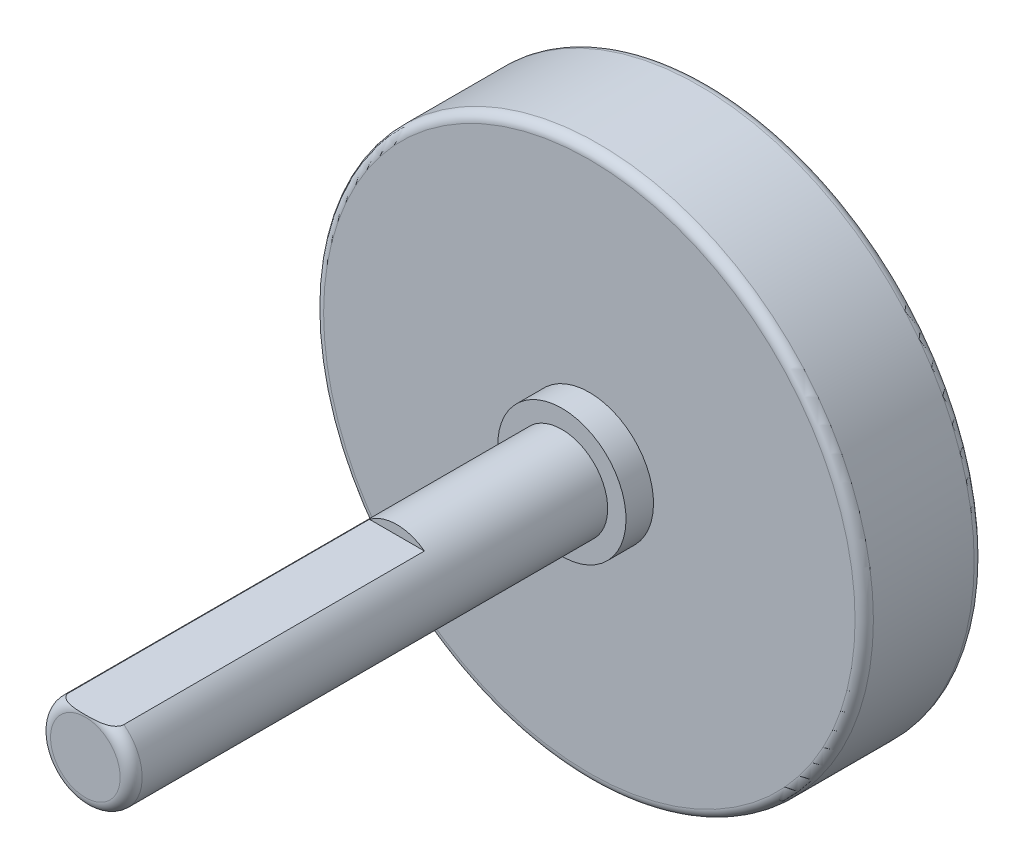
ISO-10303-21;
HEADER;
FILE_DESCRIPTION(('STEP AP214'),'2;1');
FILE_NAME('part.step','',(''),(''),'','','');
FILE_SCHEMA(('AUTOMOTIVE_DESIGN { 1 0 10303 214 1 1 1 1 }'));
ENDSEC;
DATA;
#1=APPLICATION_CONTEXT('core data for automotive mechanical design processes');
#2=APPLICATION_PROTOCOL_DEFINITION('international standard','automotive_design',2000,#1);
#3=PRODUCT_CONTEXT('',#1,'mechanical');
#4=PRODUCT('Part','Part','',(#3));
#5=PRODUCT_RELATED_PRODUCT_CATEGORY('part','',(#4));
#6=PRODUCT_DEFINITION_FORMATION('','',#4);
#7=PRODUCT_DEFINITION_CONTEXT('part definition',#1,'design');
#8=PRODUCT_DEFINITION('design','',#6,#7);
#9=PRODUCT_DEFINITION_SHAPE('','',#8);
#10=(LENGTH_UNIT() NAMED_UNIT(*) SI_UNIT(.MILLI.,.METRE.));
#11=(NAMED_UNIT(*) PLANE_ANGLE_UNIT() SI_UNIT($,.RADIAN.));
#12=(NAMED_UNIT(*) SI_UNIT($,.STERADIAN.) SOLID_ANGLE_UNIT());
#13=UNCERTAINTY_MEASURE_WITH_UNIT(LENGTH_MEASURE(1.E-05),#10,'distance_accuracy_value','');
#14=(GEOMETRIC_REPRESENTATION_CONTEXT(3) GLOBAL_UNCERTAINTY_ASSIGNED_CONTEXT((#13)) GLOBAL_UNIT_ASSIGNED_CONTEXT((#10,
#11,#12)) REPRESENTATION_CONTEXT('',''));
#15=CARTESIAN_POINT('',(0.,0.,0.));
#16=DIRECTION('',(0.,0.,1.));
#17=DIRECTION('',(1.,0.,0.));
#18=AXIS2_PLACEMENT_3D('',#15,#16,#17);
#19=CARTESIAN_POINT('',(0.,0.,33.4));
#20=DIRECTION('',(0.,0.,-1.));
#21=DIRECTION('',(-1.,0.,0.));
#22=AXIS2_PLACEMENT_3D('',#19,#20,#21);
#23=TOROIDAL_SURFACE('',#22,1.9,0.6);
#24=CARTESIAN_POINT('',(-1.49999933524292,2.00000049856764,33.4));
#25=CARTESIAN_POINT('',(-1.50006289139792,2.00000049856764,33.4238654549772));
#26=CARTESIAN_POINT('',(-1.49763116030269,2.00000049856764,33.4476605719218));
#27=CARTESIAN_POINT('',(-1.48833778054733,2.00000049856764,33.4941216497656));
#28=CARTESIAN_POINT('',(-1.48152272757625,2.00000049856764,33.5167968171453));
#29=CARTESIAN_POINT('',(-1.46403037968516,2.00000049856764,33.5604909992843));
#30=CARTESIAN_POINT('',(-1.45336524210674,2.00000049856764,33.5815149763367));
#31=CARTESIAN_POINT('',(-1.42886360140555,2.00000049856764,33.6216736514144));
#32=CARTESIAN_POINT('',(-1.41501801670444,2.00000049856764,33.6408027103319));
#33=CARTESIAN_POINT('',(-1.378370171339,2.00000049856764,33.6847414669719));
#34=CARTESIAN_POINT('',(-1.35427348974046,2.00000049856764,33.7084682232748));
#35=CARTESIAN_POINT('',(-1.30268290553185,2.00000049856764,33.7517967502607));
#36=CARTESIAN_POINT('',(-1.27518523664451,2.00000049856764,33.7713938816737));
#37=CARTESIAN_POINT('',(-1.20019861728302,2.00000049856764,33.8179442868339));
#38=CARTESIAN_POINT('',(-1.15087730899417,2.00000049856764,33.841934685935));
#39=CARTESIAN_POINT('',(-1.07473782670797,2.00000049856764,33.8723143527745));
#40=CARTESIAN_POINT('',(-1.04893521223561,2.00000049856764,33.8815215749601));
#41=CARTESIAN_POINT('',(-0.996813698677716,2.00000049856764,33.898300910332));
#42=CARTESIAN_POINT('',(-0.970495157786225,2.00000049856764,33.9058741169717));
#43=CARTESIAN_POINT('',(-0.890070889615799,2.00000049856764,33.9267395634743));
#44=CARTESIAN_POINT('',(-0.835401225040228,2.00000049856764,33.9378373791548));
#45=CARTESIAN_POINT('',(-0.725364677849389,2.00000049856764,33.9558921970375));
#46=CARTESIAN_POINT('',(-0.669996994328917,2.00000049856764,33.9628438954978));
#47=CARTESIAN_POINT('',(-0.558729996391675,2.00000049856764,33.9738987570405));
#48=CARTESIAN_POINT('',(-0.502829406281148,2.00000049856764,33.9779883509021));
#49=CARTESIAN_POINT('',(-0.390958479501827,2.00000049856764,33.9842564874222));
#50=CARTESIAN_POINT('',(-0.33498818847199,2.00000049856764,33.9864359353041));
#51=CARTESIAN_POINT('',(-0.222741993271961,2.00000049856764,33.989584429648));
#52=CARTESIAN_POINT('',(-0.166465938131547,2.00000049856764,33.9905474792202));
#53=CARTESIAN_POINT('',(-0.0538997377224472,2.00000049856764,33.9916270371808));
#54=CARTESIAN_POINT('',(0.00239040842819183,2.00000049856764,33.9917434394672));
#55=CARTESIAN_POINT('',(0.114830332687962,2.00000049856764,33.9911808029347));
#56=CARTESIAN_POINT('',(0.170980119835756,2.00000049856764,33.9905036943671));
#57=CARTESIAN_POINT('',(0.283253238887314,2.00000049856764,33.9880781997483));
#58=CARTESIAN_POINT('',(0.339376573247832,2.00000049856764,33.9863299499871));
#59=CARTESIAN_POINT('',(0.426652525361948,2.00000049856764,33.9823043189295));
#60=CARTESIAN_POINT('',(0.457830654441808,2.00000049856764,33.9806063104869));
#61=CARTESIAN_POINT('',(0.520149818200663,2.00000049856764,33.9765408297642));
#62=CARTESIAN_POINT('',(0.551290841015188,2.00000049856764,33.9741731821316));
#63=CARTESIAN_POINT('',(0.644736968794837,2.00000049856764,33.9658074083566));
#64=CARTESIAN_POINT('',(0.706947976863873,2.00000049856764,33.9585506286239));
#65=CARTESIAN_POINT('',(0.810195186826884,2.00000049856764,33.9421639876438));
#66=CARTESIAN_POINT('',(0.851450084852507,2.00000049856764,33.9344405658155));
#67=CARTESIAN_POINT('',(0.933347141129014,2.00000049856764,33.916013202358));
#68=CARTESIAN_POINT('',(0.973988764051685,2.00000049856764,33.9053067994782));
#69=CARTESIAN_POINT('',(1.05383500120298,2.00000049856764,33.8802162550324));
#70=CARTESIAN_POINT('',(1.09304767636097,2.00000049856764,33.8658583527534));
#71=CARTESIAN_POINT('',(1.16943723121691,2.00000049856764,33.8325517374706));
#72=CARTESIAN_POINT('',(1.20661887116579,2.00000049856764,33.8136143781774));
#73=CARTESIAN_POINT('',(1.26574668381795,2.00000049856764,33.7774480969262));
#74=CARTESIAN_POINT('',(1.28863203367989,2.00000049856764,33.7617629941411));
#75=CARTESIAN_POINT('',(1.33231865290933,2.00000049856764,33.7276517458637));
#76=CARTESIAN_POINT('',(1.35311874454431,2.00000049856764,33.7092240658261));
#77=CARTESIAN_POINT('',(1.39198161929901,2.00000049856764,33.6692791875507));
#78=CARTESIAN_POINT('',(1.4100155042373,2.00000049856764,33.6477334168575));
#79=CARTESIAN_POINT('',(1.4419892170703,2.00000049856764,33.6017699453952));
#80=CARTESIAN_POINT('',(1.45593520722605,2.00000049856764,33.5773566458934));
#81=CARTESIAN_POINT('',(1.47579889867747,2.00000049856764,33.5324301962894));
#82=CARTESIAN_POINT('',(1.4828446399221,2.00000049856764,33.5124151426362));
#83=CARTESIAN_POINT('',(1.4934623833156,2.00000049856764,33.4715100404609));
#84=CARTESIAN_POINT('',(1.49704291668692,2.00000049856764,33.4506222736075));
#85=CARTESIAN_POINT('',(1.49959579128669,2.00000049856764,33.4197519201389));
#86=CARTESIAN_POINT('',(1.50000591412591,2.00000049856764,33.4098738683302));
#87=CARTESIAN_POINT('',(1.49999933524294,2.00000049856764,33.4));
#88=B_SPLINE_CURVE_WITH_KNOTS('',3,(#24,#25,#26,#27,#28,#29,#30,#31,#32,#33,#34,#35,#36,#37,#38,
#39,#40,#41,#42,#43,#44,#45,#46,#47,#48,#49,#50,#51,#52,#53,#54,#55,#56,#57,#58,#59,#60,#61,#62,
#63,#64,#65,#66,#67,#68,#69,#70,#71,#72,#73,#74,#75,#76,#77,#78,#79,#80,#81,#82,#83,#84,#85,#86,
#87),.UNSPECIFIED.,.F.,.F.,(4,2,2,2,2,2,2,2,2,2,2,2,2,2,2,2,2,2,2,2,2,2,2,2,2,2,2,2,2,2,2,4),
(0.,0.0713612633692439,0.141976204315775,0.21237008870792,0.282967533850777,0.383847364191901,
0.484839926985531,0.648391491417212,0.730554388592897,0.81266213214347,0.979759761476981,
1.14707068733364,1.31516955590556,1.48318871881796,1.65203302993229,1.82089850027247,
1.98935404886022,2.15778816792599,2.25145408795464,2.34514455817809,2.53287691543237,
2.65871229833492,2.78465181676117,2.90971072912901,3.03446270946562,3.11752631426496,
3.20063657132563,3.28456328837293,3.36836283241645,3.43175442521992,3.4949895500583,
3.52461517331955),.UNSPECIFIED.);
#89=CARTESIAN_POINT('',(-1.49999933524291,2.00000049856764,33.4));
#90=VERTEX_POINT('',#89);
#91=CARTESIAN_POINT('',(1.49999933524291,2.00000049856764,33.4));
#92=VERTEX_POINT('',#91);
#93=EDGE_CURVE('E21',#90,#92,#88,.T.);
#94=ORIENTED_EDGE('',*,*,#93,.F.);
#95=CARTESIAN_POINT('',(0.,0.,33.4));
#96=DIRECTION('',(0.,0.,-1.));
#97=DIRECTION('',(-1.,0.,0.));
#98=AXIS2_PLACEMENT_3D('',#95,#96,#97);
#99=CIRCLE('',#98,2.5);
#100=EDGE_CURVE('E67',#92,#90,#99,.T.);
#101=ORIENTED_EDGE('',*,*,#100,.F.);
#102=EDGE_LOOP('',(#94,#101));
#103=FACE_BOUND('',#102,.T.);
#104=CARTESIAN_POINT('',(0.,0.,34.));
#105=DIRECTION('',(0.,0.,1.));
#106=DIRECTION('',(-1.,0.,0.));
#107=AXIS2_PLACEMENT_3D('',#104,#105,#106);
#108=CIRCLE('',#107,1.9);
#109=CARTESIAN_POINT('',(-1.9,0.,34.));
#110=VERTEX_POINT('',#109);
#111=EDGE_CURVE('E97',#110,#110,#108,.T.);
#112=ORIENTED_EDGE('',*,*,#111,.F.);
#113=EDGE_LOOP('',(#112));
#114=FACE_BOUND('',#113,.T.);
#115=ADVANCED_FACE('F17',(#103,#114),#23,.T.);
#116=CARTESIAN_POINT('',(0.,0.,17.));
#117=DIRECTION('',(0.,0.,-1.));
#118=DIRECTION('',(0.,-1.,0.));
#119=AXIS2_PLACEMENT_3D('',#116,#117,#118);
#120=PLANE('',#119);
#121=DIRECTION('',(-1.,0.,0.));
#122=VECTOR('',#121,1.);
#123=CARTESIAN_POINT('',(0.,2.00000049856764,17.));
#124=LINE('',#123,#122);
#125=CARTESIAN_POINT('',(1.49999933524291,2.00000049856764,17.));
#126=VERTEX_POINT('',#125);
#127=CARTESIAN_POINT('',(-1.49999933524291,2.00000049856764,17.));
#128=VERTEX_POINT('',#127);
#129=EDGE_CURVE('E11',#126,#128,#124,.T.);
#130=ORIENTED_EDGE('',*,*,#129,.F.);
#131=CARTESIAN_POINT('',(0.,0.,17.));
#132=DIRECTION('',(0.,0.,-1.));
#133=DIRECTION('',(1.,0.,0.));
#134=AXIS2_PLACEMENT_3D('',#131,#132,#133);
#135=CIRCLE('',#134,2.5);
#136=EDGE_CURVE('E74',#128,#126,#135,.T.);
#137=ORIENTED_EDGE('',*,*,#136,.F.);
#138=EDGE_LOOP('',(#130,#137));
#139=FACE_BOUND('',#138,.T.);
#140=ADVANCED_FACE('F173',(#139),#120,.F.);
#141=CARTESIAN_POINT('',(0.,2.00000049856764,17.));
#142=DIRECTION('',(0.,1.,0.));
#143=DIRECTION('',(1.,0.,0.));
#144=AXIS2_PLACEMENT_3D('',#141,#142,#143);
#145=PLANE('',#144);
#146=DIRECTION('',(0.,0.,1.));
#147=VECTOR('',#146,1.);
#148=CARTESIAN_POINT('',(-1.49999933524291,2.00000049856764,17.));
#149=LINE('',#148,#147);
#150=EDGE_CURVE('E62',#128,#90,#149,.T.);
#151=ORIENTED_EDGE('',*,*,#150,.T.);
#152=ORIENTED_EDGE('',*,*,#93,.T.);
#153=DIRECTION('',(0.,0.,1.));
#154=VECTOR('',#153,1.);
#155=CARTESIAN_POINT('',(1.49999933524291,2.00000049856764,17.));
#156=LINE('',#155,#154);
#157=EDGE_CURVE('E60',#126,#92,#156,.T.);
#158=ORIENTED_EDGE('',*,*,#157,.F.);
#159=ORIENTED_EDGE('',*,*,#129,.T.);
#160=EDGE_LOOP('',(#151,#152,#158,#159));
#161=FACE_BOUND('',#160,.T.);
#162=ADVANCED_FACE('F58',(#161),#145,.T.);
#163=CARTESIAN_POINT('',(0.,0.,-7.4));
#164=DIRECTION('',(0.,0.,1.));
#165=DIRECTION('',(1.,0.,0.));
#166=AXIS2_PLACEMENT_3D('',#163,#164,#165);
#167=TOROIDAL_SURFACE('',#166,1.9,0.6);
#168=CARTESIAN_POINT('',(0.,0.,-7.4));
#169=DIRECTION('',(0.,0.,1.));
#170=DIRECTION('',(1.,0.,0.));
#171=AXIS2_PLACEMENT_3D('',#168,#169,#170);
#172=CIRCLE('',#171,2.5);
#173=CARTESIAN_POINT('',(2.5,0.,-7.4));
#174=VERTEX_POINT('',#173);
#175=EDGE_CURVE('E88',#174,#174,#172,.T.);
#176=ORIENTED_EDGE('',*,*,#175,.F.);
#177=EDGE_LOOP('',(#176));
#178=FACE_BOUND('',#177,.T.);
#179=CARTESIAN_POINT('',(0.,0.,-8.));
#180=DIRECTION('',(0.,0.,-1.));
#181=DIRECTION('',(1.,0.,0.));
#182=AXIS2_PLACEMENT_3D('',#179,#180,#181);
#183=CIRCLE('',#182,1.9);
#184=CARTESIAN_POINT('',(1.9,0.,-8.));
#185=VERTEX_POINT('',#184);
#186=EDGE_CURVE('E66',#185,#185,#183,.T.);
#187=ORIENTED_EDGE('',*,*,#186,.F.);
#188=EDGE_LOOP('',(#187));
#189=FACE_BOUND('',#188,.T.);
#190=ADVANCED_FACE('F180',(#178,#189),#167,.T.);
#191=CARTESIAN_POINT('',(0.,0.,-8.));
#192=DIRECTION('',(0.,0.,1.));
#193=DIRECTION('',(1.,0.,0.));
#194=AXIS2_PLACEMENT_3D('',#191,#192,#193);
#195=PLANE('',#194);
#196=ORIENTED_EDGE('',*,*,#186,.T.);
#197=EDGE_LOOP('',(#196));
#198=FACE_BOUND('',#197,.T.);
#199=ADVANCED_FACE('F183',(#198),#195,.F.);
#200=CARTESIAN_POINT('',(0.,0.,-8.));
#201=DIRECTION('',(0.,0.,1.));
#202=DIRECTION('',(1.,0.,0.));
#203=AXIS2_PLACEMENT_3D('',#200,#201,#202);
#204=CYLINDRICAL_SURFACE('',#203,2.5);
#205=CARTESIAN_POINT('',(0.,0.,-2.));
#206=DIRECTION('',(0.,0.,1.));
#207=DIRECTION('',(1.,0.,0.));
#208=AXIS2_PLACEMENT_3D('',#205,#206,#207);
#209=CIRCLE('',#208,2.5);
#210=CARTESIAN_POINT('',(2.5,0.,-2.));
#211=VERTEX_POINT('',#210);
#212=EDGE_CURVE('E89',#211,#211,#209,.T.);
#213=ORIENTED_EDGE('',*,*,#212,.F.);
#214=EDGE_LOOP('',(#213));
#215=FACE_BOUND('',#214,.T.);
#216=ORIENTED_EDGE('',*,*,#175,.T.);
#217=EDGE_LOOP('',(#216));
#218=FACE_BOUND('',#217,.T.);
#219=ADVANCED_FACE('F192',(#215,#218),#204,.T.);
#220=CARTESIAN_POINT('',(0.,0.,-2.));
#221=DIRECTION('',(0.,0.,1.));
#222=DIRECTION('',(1.,0.,0.));
#223=AXIS2_PLACEMENT_3D('',#220,#221,#222);
#224=PLANE('',#223);
#225=CARTESIAN_POINT('',(0.,0.,-2.));
#226=DIRECTION('',(0.,0.,1.));
#227=DIRECTION('',(1.,0.,0.));
#228=AXIS2_PLACEMENT_3D('',#225,#226,#227);
#229=CIRCLE('',#228,3.5);
#230=CARTESIAN_POINT('',(3.5,0.,-2.));
#231=VERTEX_POINT('',#230);
#232=EDGE_CURVE('E93',#231,#231,#229,.T.);
#233=ORIENTED_EDGE('',*,*,#232,.F.);
#234=EDGE_LOOP('',(#233));
#235=FACE_BOUND('',#234,.T.);
#236=ORIENTED_EDGE('',*,*,#212,.T.);
#237=EDGE_LOOP('',(#236));
#238=FACE_BOUND('',#237,.T.);
#239=ADVANCED_FACE('F197',(#235,#238),#224,.F.);
#240=CARTESIAN_POINT('',(0.,0.,-2.));
#241=DIRECTION('',(0.,0.,1.));
#242=DIRECTION('',(1.,0.,0.));
#243=AXIS2_PLACEMENT_3D('',#240,#241,#242);
#244=CYLINDRICAL_SURFACE('',#243,3.5);
#245=CARTESIAN_POINT('',(0.,0.,0.));
#246=DIRECTION('',(0.,0.,-1.));
#247=DIRECTION('',(-1.,0.,0.));
#248=AXIS2_PLACEMENT_3D('',#245,#246,#247);
#249=CIRCLE('',#248,3.5);
#250=CARTESIAN_POINT('',(-3.5,0.,0.));
#251=VERTEX_POINT('',#250);
#252=EDGE_CURVE('E106',#251,#251,#249,.T.);
#253=ORIENTED_EDGE('',*,*,#252,.T.);
#254=EDGE_LOOP('',(#253));
#255=FACE_BOUND('',#254,.T.);
#256=ORIENTED_EDGE('',*,*,#232,.T.);
#257=EDGE_LOOP('',(#256));
#258=FACE_BOUND('',#257,.T.);
#259=ADVANCED_FACE('F189',(#255,#258),#244,.T.);
#260=CARTESIAN_POINT('',(0.,0.,34.));
#261=DIRECTION('',(0.,0.,-1.));
#262=DIRECTION('',(0.,-1.,0.));
#263=AXIS2_PLACEMENT_3D('',#260,#261,#262);
#264=PLANE('',#263);
#265=ORIENTED_EDGE('',*,*,#111,.T.);
#266=EDGE_LOOP('',(#265));
#267=FACE_BOUND('',#266,.T.);
#268=ADVANCED_FACE('F161',(#267),#264,.F.);
#269=CARTESIAN_POINT('',(0.,0.,8.));
#270=DIRECTION('',(0.,0.,-1.));
#271=DIRECTION('',(0.,-1.,0.));
#272=AXIS2_PLACEMENT_3D('',#269,#270,#271);
#273=PLANE('',#272);
#274=CARTESIAN_POINT('',(0.,0.,8.));
#275=DIRECTION('',(0.,0.,-1.));
#276=DIRECTION('',(0.,1.,0.));
#277=AXIS2_PLACEMENT_3D('',#274,#275,#276);
#278=CIRCLE('',#277,3.5);
#279=CARTESIAN_POINT('',(0.,3.5,8.));
#280=VERTEX_POINT('',#279);
#281=EDGE_CURVE('E98',#280,#280,#278,.T.);
#282=ORIENTED_EDGE('',*,*,#281,.F.);
#283=EDGE_LOOP('',(#282));
#284=FACE_BOUND('',#283,.T.);
#285=CARTESIAN_POINT('',(0.,0.,8.));
#286=DIRECTION('',(0.,0.,-1.));
#287=DIRECTION('',(0.,1.,0.));
#288=AXIS2_PLACEMENT_3D('',#285,#286,#287);
#289=CIRCLE('',#288,2.5);
#290=CARTESIAN_POINT('',(0.,2.5,8.));
#291=VERTEX_POINT('',#290);
#292=EDGE_CURVE('E76',#291,#291,#289,.T.);
#293=ORIENTED_EDGE('',*,*,#292,.T.);
#294=EDGE_LOOP('',(#293));
#295=FACE_BOUND('',#294,.T.);
#296=ADVANCED_FACE('F155',(#284,#295),#273,.F.);
#297=CARTESIAN_POINT('',(0.,0.,8.));
#298=DIRECTION('',(0.,0.,-1.));
#299=DIRECTION('',(-1.,0.,0.));
#300=AXIS2_PLACEMENT_3D('',#297,#298,#299);
#301=CYLINDRICAL_SURFACE('',#300,3.5);
#302=CARTESIAN_POINT('',(0.,0.,6.5));
#303=DIRECTION('',(0.,0.,-1.));
#304=DIRECTION('',(0.,1.,0.));
#305=AXIS2_PLACEMENT_3D('',#302,#303,#304);
#306=CIRCLE('',#305,3.5);
#307=CARTESIAN_POINT('',(0.,3.5,6.5));
#308=VERTEX_POINT('',#307);
#309=EDGE_CURVE('E114',#308,#308,#306,.T.);
#310=ORIENTED_EDGE('',*,*,#309,.F.);
#311=EDGE_LOOP('',(#310));
#312=FACE_BOUND('',#311,.T.);
#313=ORIENTED_EDGE('',*,*,#281,.T.);
#314=EDGE_LOOP('',(#313));
#315=FACE_BOUND('',#314,.T.);
#316=ADVANCED_FACE('F152',(#312,#315),#301,.T.);
#317=CARTESIAN_POINT('',(0.,0.,0.5));
#318=DIRECTION('',(0.,0.,-1.));
#319=DIRECTION('',(-1.,0.,0.));
#320=AXIS2_PLACEMENT_3D('',#317,#318,#319);
#321=TOROIDAL_SURFACE('',#320,14.5,0.5);
#322=CARTESIAN_POINT('',(0.,0.,0.));
#323=DIRECTION('',(0.,0.,-1.));
#324=DIRECTION('',(-1.,0.,0.));
#325=AXIS2_PLACEMENT_3D('',#322,#323,#324);
#326=CIRCLE('',#325,14.5);
#327=CARTESIAN_POINT('',(-14.5,0.,0.));
#328=VERTEX_POINT('',#327);
#329=EDGE_CURVE('E102',#328,#328,#326,.T.);
#330=ORIENTED_EDGE('',*,*,#329,.F.);
#331=EDGE_LOOP('',(#330));
#332=FACE_BOUND('',#331,.T.);
#333=CARTESIAN_POINT('',(0.,0.,0.5));
#334=DIRECTION('',(0.,0.,1.));
#335=DIRECTION('',(-1.,0.,0.));
#336=AXIS2_PLACEMENT_3D('',#333,#334,#335);
#337=CIRCLE('',#336,15.);
#338=CARTESIAN_POINT('',(-15.,0.,0.5));
#339=VERTEX_POINT('',#338);
#340=EDGE_CURVE('E122',#339,#339,#337,.T.);
#341=ORIENTED_EDGE('',*,*,#340,.F.);
#342=EDGE_LOOP('',(#341));
#343=FACE_BOUND('',#342,.T.);
#344=ADVANCED_FACE('F142',(#332,#343),#321,.T.);
#345=CARTESIAN_POINT('',(0.,0.,6.));
#346=DIRECTION('',(0.,0.,-1.));
#347=DIRECTION('',(-1.,0.,0.));
#348=AXIS2_PLACEMENT_3D('',#345,#346,#347);
#349=TOROIDAL_SURFACE('',#348,14.5,0.5);
#350=CARTESIAN_POINT('',(0.,0.,6.));
#351=DIRECTION('',(0.,0.,-1.));
#352=DIRECTION('',(-1.,0.,0.));
#353=AXIS2_PLACEMENT_3D('',#350,#351,#352);
#354=CIRCLE('',#353,15.);
#355=CARTESIAN_POINT('',(-15.,0.,6.));
#356=VERTEX_POINT('',#355);
#357=EDGE_CURVE('E118',#356,#356,#354,.T.);
#358=ORIENTED_EDGE('',*,*,#357,.F.);
#359=EDGE_LOOP('',(#358));
#360=FACE_BOUND('',#359,.T.);
#361=CARTESIAN_POINT('',(0.,0.,6.5));
#362=DIRECTION('',(0.,0.,1.));
#363=DIRECTION('',(-1.,0.,0.));
#364=AXIS2_PLACEMENT_3D('',#361,#362,#363);
#365=CIRCLE('',#364,14.5);
#366=CARTESIAN_POINT('',(-14.5,0.,6.5));
#367=VERTEX_POINT('',#366);
#368=EDGE_CURVE('E110',#367,#367,#365,.T.);
#369=ORIENTED_EDGE('',*,*,#368,.F.);
#370=EDGE_LOOP('',(#369));
#371=FACE_BOUND('',#370,.T.);
#372=ADVANCED_FACE('F138',(#360,#371),#349,.T.);
#373=CARTESIAN_POINT('',(0.,0.,0.));
#374=DIRECTION('',(0.,0.,-1.));
#375=DIRECTION('',(0.,-1.,0.));
#376=AXIS2_PLACEMENT_3D('',#373,#374,#375);
#377=PLANE('',#376);
#378=ORIENTED_EDGE('',*,*,#329,.T.);
#379=EDGE_LOOP('',(#378));
#380=FACE_BOUND('',#379,.T.);
#381=ORIENTED_EDGE('',*,*,#252,.F.);
#382=EDGE_LOOP('',(#381));
#383=FACE_BOUND('',#382,.T.);
#384=ADVANCED_FACE('F141',(#380,#383),#377,.T.);
#385=CARTESIAN_POINT('',(0.,0.,6.5));
#386=DIRECTION('',(0.,0.,-1.));
#387=DIRECTION('',(0.,-1.,0.));
#388=AXIS2_PLACEMENT_3D('',#385,#386,#387);
#389=PLANE('',#388);
#390=ORIENTED_EDGE('',*,*,#368,.T.);
#391=EDGE_LOOP('',(#390));
#392=FACE_BOUND('',#391,.T.);
#393=ORIENTED_EDGE('',*,*,#309,.T.);
#394=EDGE_LOOP('',(#393));
#395=FACE_BOUND('',#394,.T.);
#396=ADVANCED_FACE('F146',(#392,#395),#389,.F.);
#397=CARTESIAN_POINT('',(0.,0.,6.5));
#398=DIRECTION('',(0.,0.,-1.));
#399=DIRECTION('',(-1.,0.,0.));
#400=AXIS2_PLACEMENT_3D('',#397,#398,#399);
#401=CYLINDRICAL_SURFACE('',#400,15.);
#402=ORIENTED_EDGE('',*,*,#357,.T.);
#403=EDGE_LOOP('',(#402));
#404=FACE_BOUND('',#403,.T.);
#405=ORIENTED_EDGE('',*,*,#340,.T.);
#406=EDGE_LOOP('',(#405));
#407=FACE_BOUND('',#406,.T.);
#408=ADVANCED_FACE('F135',(#404,#407),#401,.T.);
#409=CARTESIAN_POINT('',(0.,0.,34.));
#410=DIRECTION('',(0.,0.,-1.));
#411=DIRECTION('',(-1.,0.,0.));
#412=AXIS2_PLACEMENT_3D('',#409,#410,#411);
#413=CYLINDRICAL_SURFACE('',#412,2.5);
#414=ORIENTED_EDGE('',*,*,#157,.T.);
#415=ORIENTED_EDGE('',*,*,#100,.T.);
#416=ORIENTED_EDGE('',*,*,#150,.F.);
#417=ORIENTED_EDGE('',*,*,#136,.T.);
#418=EDGE_LOOP('',(#414,#415,#416,#417));
#419=FACE_BOUND('',#418,.T.);
#420=ORIENTED_EDGE('',*,*,#292,.F.);
#421=EDGE_LOOP('',(#420));
#422=FACE_BOUND('',#421,.T.);
#423=ADVANCED_FACE('F72',(#419,#422),#413,.T.);
#424=CLOSED_SHELL('',(#115,#140,#162,#190,#199,#219,#239,#259,#268,#296,#316,#344,#372,#384,
#396,#408,#423));
#425=MANIFOLD_SOLID_BREP('B1',#424);
#426=ADVANCED_BREP_SHAPE_REPRESENTATION('',(#18,#425),#14);
#427=SHAPE_DEFINITION_REPRESENTATION(#9,#426);
ENDSEC;
END-ISO-10303-21;
